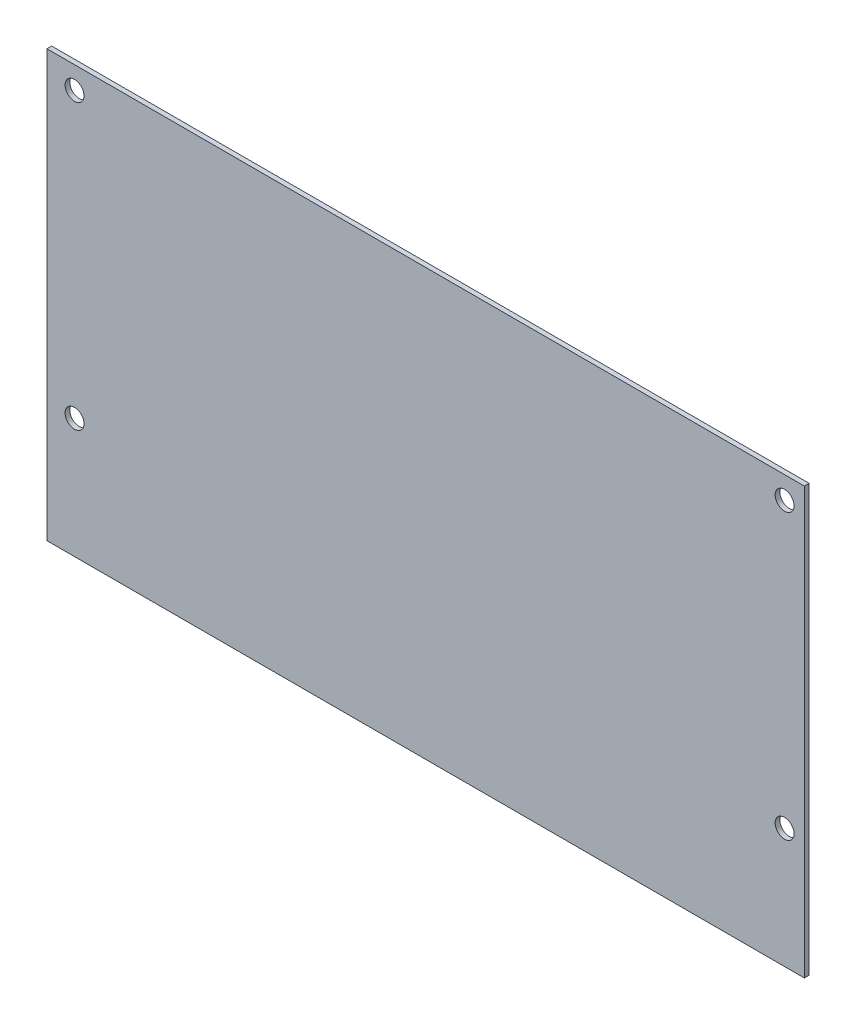
ISO-10303-21;
HEADER;
FILE_DESCRIPTION(('STEP AP214'),'2;1');
FILE_NAME('part.step','',(''),(''),'','','');
FILE_SCHEMA(('AUTOMOTIVE_DESIGN { 1 0 10303 214 1 1 1 1 }'));
ENDSEC;
DATA;
#1=APPLICATION_CONTEXT('core data for automotive mechanical design processes');
#2=APPLICATION_PROTOCOL_DEFINITION('international standard','automotive_design',2000,#1);
#3=PRODUCT_CONTEXT('',#1,'mechanical');
#4=PRODUCT('Part','Part','',(#3));
#5=PRODUCT_RELATED_PRODUCT_CATEGORY('part','',(#4));
#6=PRODUCT_DEFINITION_FORMATION('','',#4);
#7=PRODUCT_DEFINITION_CONTEXT('part definition',#1,'design');
#8=PRODUCT_DEFINITION('design','',#6,#7);
#9=PRODUCT_DEFINITION_SHAPE('','',#8);
#10=(LENGTH_UNIT() NAMED_UNIT(*) SI_UNIT(.MILLI.,.METRE.));
#11=(NAMED_UNIT(*) PLANE_ANGLE_UNIT() SI_UNIT($,.RADIAN.));
#12=(NAMED_UNIT(*) SI_UNIT($,.STERADIAN.) SOLID_ANGLE_UNIT());
#13=UNCERTAINTY_MEASURE_WITH_UNIT(LENGTH_MEASURE(1.E-05),#10,'distance_accuracy_value','');
#14=(GEOMETRIC_REPRESENTATION_CONTEXT(3) GLOBAL_UNCERTAINTY_ASSIGNED_CONTEXT((#13)) GLOBAL_UNIT_ASSIGNED_CONTEXT((#10,
#11,#12)) REPRESENTATION_CONTEXT('',''));
#15=CARTESIAN_POINT('',(0.,0.,0.));
#16=DIRECTION('',(0.,0.,1.));
#17=DIRECTION('',(1.,0.,0.));
#18=AXIS2_PLACEMENT_3D('',#15,#16,#17);
#19=CARTESIAN_POINT('',(0.,0.,1.));
#20=DIRECTION('',(1.,0.,0.));
#21=DIRECTION('',(0.,0.,-1.));
#22=AXIS2_PLACEMENT_3D('',#19,#20,#21);
#23=PLANE('',#22);
#24=DIRECTION('',(0.,-1.,0.));
#25=VECTOR('',#24,1.);
#26=CARTESIAN_POINT('',(0.,0.,0.));
#27=LINE('',#26,#25);
#28=CARTESIAN_POINT('',(0.,90.,0.));
#29=VERTEX_POINT('',#28);
#30=CARTESIAN_POINT('',(0.,0.,0.));
#31=VERTEX_POINT('',#30);
#32=EDGE_CURVE('E103',#29,#31,#27,.T.);
#33=ORIENTED_EDGE('',*,*,#32,.T.);
#34=DIRECTION('',(0.,0.,-1.));
#35=VECTOR('',#34,1.);
#36=CARTESIAN_POINT('',(0.,0.,1.));
#37=LINE('',#36,#35);
#38=CARTESIAN_POINT('',(0.,0.,1.));
#39=VERTEX_POINT('',#38);
#40=EDGE_CURVE('E11',#39,#31,#37,.T.);
#41=ORIENTED_EDGE('',*,*,#40,.F.);
#42=DIRECTION('',(0.,-1.,0.));
#43=VECTOR('',#42,1.);
#44=CARTESIAN_POINT('',(0.,0.,1.));
#45=LINE('',#44,#43);
#46=CARTESIAN_POINT('',(0.,90.,1.));
#47=VERTEX_POINT('',#46);
#48=EDGE_CURVE('E90',#47,#39,#45,.T.);
#49=ORIENTED_EDGE('',*,*,#48,.F.);
#50=DIRECTION('',(0.,0.,-1.));
#51=VECTOR('',#50,1.);
#52=CARTESIAN_POINT('',(0.,90.,1.));
#53=LINE('',#52,#51);
#54=EDGE_CURVE('E99',#47,#29,#53,.T.);
#55=ORIENTED_EDGE('',*,*,#54,.T.);
#56=EDGE_LOOP('',(#33,#41,#49,#55));
#57=FACE_BOUND('',#56,.T.);
#58=ADVANCED_FACE('F37',(#57),#23,.F.);
#59=CARTESIAN_POINT('',(0.,0.,1.));
#60=DIRECTION('',(0.,1.,0.));
#61=DIRECTION('',(0.,0.,1.));
#62=AXIS2_PLACEMENT_3D('',#59,#60,#61);
#63=PLANE('',#62);
#64=DIRECTION('',(1.,0.,0.));
#65=VECTOR('',#64,1.);
#66=CARTESIAN_POINT('',(0.,0.,0.));
#67=LINE('',#66,#65);
#68=CARTESIAN_POINT('',(160.,0.,0.));
#69=VERTEX_POINT('',#68);
#70=EDGE_CURVE('E94',#31,#69,#67,.T.);
#71=ORIENTED_EDGE('',*,*,#70,.T.);
#72=DIRECTION('',(0.,0.,-1.));
#73=VECTOR('',#72,1.);
#74=CARTESIAN_POINT('',(160.,0.,1.));
#75=LINE('',#74,#73);
#76=CARTESIAN_POINT('',(160.,0.,1.));
#77=VERTEX_POINT('',#76);
#78=EDGE_CURVE('E46',#77,#69,#75,.T.);
#79=ORIENTED_EDGE('',*,*,#78,.F.);
#80=DIRECTION('',(1.,0.,0.));
#81=VECTOR('',#80,1.);
#82=CARTESIAN_POINT('',(0.,0.,1.));
#83=LINE('',#82,#81);
#84=EDGE_CURVE('E85',#39,#77,#83,.T.);
#85=ORIENTED_EDGE('',*,*,#84,.F.);
#86=ORIENTED_EDGE('',*,*,#40,.T.);
#87=EDGE_LOOP('',(#71,#79,#85,#86));
#88=FACE_BOUND('',#87,.T.);
#89=ADVANCED_FACE('F93',(#88),#63,.F.);
#90=CARTESIAN_POINT('',(160.,0.,1.));
#91=DIRECTION('',(-1.,0.,0.));
#92=DIRECTION('',(0.,0.,1.));
#93=AXIS2_PLACEMENT_3D('',#90,#91,#92);
#94=PLANE('',#93);
#95=DIRECTION('',(0.,1.,0.));
#96=VECTOR('',#95,1.);
#97=CARTESIAN_POINT('',(160.,0.,0.));
#98=LINE('',#97,#96);
#99=CARTESIAN_POINT('',(160.,90.,0.));
#100=VERTEX_POINT('',#99);
#101=EDGE_CURVE('E72',#69,#100,#98,.T.);
#102=ORIENTED_EDGE('',*,*,#101,.T.);
#103=DIRECTION('',(0.,0.,-1.));
#104=VECTOR('',#103,1.);
#105=CARTESIAN_POINT('',(160.,90.,1.));
#106=LINE('',#105,#104);
#107=CARTESIAN_POINT('',(160.,90.,1.));
#108=VERTEX_POINT('',#107);
#109=EDGE_CURVE('E95',#108,#100,#106,.T.);
#110=ORIENTED_EDGE('',*,*,#109,.F.);
#111=DIRECTION('',(0.,1.,0.));
#112=VECTOR('',#111,1.);
#113=CARTESIAN_POINT('',(160.,0.,1.));
#114=LINE('',#113,#112);
#115=EDGE_CURVE('E88',#77,#108,#114,.T.);
#116=ORIENTED_EDGE('',*,*,#115,.F.);
#117=ORIENTED_EDGE('',*,*,#78,.T.);
#118=EDGE_LOOP('',(#102,#110,#116,#117));
#119=FACE_BOUND('',#118,.T.);
#120=ADVANCED_FACE('F97',(#119),#94,.F.);
#121=CARTESIAN_POINT('',(0.,90.,1.));
#122=DIRECTION('',(0.,-1.,0.));
#123=DIRECTION('',(0.,0.,-1.));
#124=AXIS2_PLACEMENT_3D('',#121,#122,#123);
#125=PLANE('',#124);
#126=DIRECTION('',(-1.,0.,0.));
#127=VECTOR('',#126,1.);
#128=CARTESIAN_POINT('',(0.,90.,0.));
#129=LINE('',#128,#127);
#130=EDGE_CURVE('E78',#100,#29,#129,.T.);
#131=ORIENTED_EDGE('',*,*,#130,.T.);
#132=ORIENTED_EDGE('',*,*,#54,.F.);
#133=DIRECTION('',(-1.,0.,0.));
#134=VECTOR('',#133,1.);
#135=CARTESIAN_POINT('',(0.,90.,1.));
#136=LINE('',#135,#134);
#137=EDGE_CURVE('E55',#108,#47,#136,.T.);
#138=ORIENTED_EDGE('',*,*,#137,.F.);
#139=ORIENTED_EDGE('',*,*,#109,.T.);
#140=EDGE_LOOP('',(#131,#132,#138,#139));
#141=FACE_BOUND('',#140,.T.);
#142=ADVANCED_FACE('F139',(#141),#125,.F.);
#143=CARTESIAN_POINT('',(0.,0.,1.));
#144=DIRECTION('',(0.,0.,-1.));
#145=DIRECTION('',(-1.,0.,0.));
#146=AXIS2_PLACEMENT_3D('',#143,#144,#145);
#147=PLANE('',#146);
#148=CARTESIAN_POINT('',(5.83216523004638,25.3004824183685,1.));
#149=DIRECTION('',(0.,0.,1.));
#150=DIRECTION('',(1.,0.,0.));
#151=AXIS2_PLACEMENT_3D('',#148,#149,#150);
#152=CIRCLE('',#151,1.99999999999999);
#153=CARTESIAN_POINT('',(7.83216523004637,25.3004824183685,1.));
#154=VERTEX_POINT('',#153);
#155=EDGE_CURVE('E221',#154,#154,#152,.T.);
#156=ORIENTED_EDGE('',*,*,#155,.F.);
#157=EDGE_LOOP('',(#156));
#158=FACE_BOUND('',#157,.T.);
#159=CARTESIAN_POINT('',(155.832165230046,25.3004824183685,1.));
#160=DIRECTION('',(0.,0.,1.));
#161=DIRECTION('',(1.,0.,0.));
#162=AXIS2_PLACEMENT_3D('',#159,#160,#161);
#163=CIRCLE('',#162,2.);
#164=CARTESIAN_POINT('',(157.832165230046,25.3004824183685,1.));
#165=VERTEX_POINT('',#164);
#166=EDGE_CURVE('E218',#165,#165,#163,.T.);
#167=ORIENTED_EDGE('',*,*,#166,.F.);
#168=EDGE_LOOP('',(#167));
#169=FACE_BOUND('',#168,.T.);
#170=CARTESIAN_POINT('',(155.832165230046,85.3004824183685,1.));
#171=DIRECTION('',(0.,0.,1.));
#172=DIRECTION('',(1.,0.,0.));
#173=AXIS2_PLACEMENT_3D('',#170,#171,#172);
#174=CIRCLE('',#173,2.);
#175=CARTESIAN_POINT('',(157.832165230046,85.3004824183685,1.));
#176=VERTEX_POINT('',#175);
#177=EDGE_CURVE('E220',#176,#176,#174,.T.);
#178=ORIENTED_EDGE('',*,*,#177,.F.);
#179=EDGE_LOOP('',(#178));
#180=FACE_BOUND('',#179,.T.);
#181=CARTESIAN_POINT('',(5.83216523004637,85.3004824183685,1.));
#182=DIRECTION('',(0.,0.,1.));
#183=DIRECTION('',(1.,0.,0.));
#184=AXIS2_PLACEMENT_3D('',#181,#182,#183);
#185=CIRCLE('',#184,2.00000000000001);
#186=CARTESIAN_POINT('',(7.83216523004638,85.3004824183685,1.));
#187=VERTEX_POINT('',#186);
#188=EDGE_CURVE('E115',#187,#187,#185,.T.);
#189=ORIENTED_EDGE('',*,*,#188,.F.);
#190=EDGE_LOOP('',(#189));
#191=FACE_BOUND('',#190,.T.);
#192=ORIENTED_EDGE('',*,*,#48,.T.);
#193=ORIENTED_EDGE('',*,*,#84,.T.);
#194=ORIENTED_EDGE('',*,*,#115,.T.);
#195=ORIENTED_EDGE('',*,*,#137,.T.);
#196=EDGE_LOOP('',(#192,#193,#194,#195));
#197=FACE_BOUND('',#196,.T.);
#198=ADVANCED_FACE('F86',(#158,#169,#180,#191,#197),#147,.F.);
#199=CARTESIAN_POINT('',(0.,0.,0.));
#200=DIRECTION('',(0.,0.,-1.));
#201=DIRECTION('',(-1.,0.,0.));
#202=AXIS2_PLACEMENT_3D('',#199,#200,#201);
#203=PLANE('',#202);
#204=CARTESIAN_POINT('',(5.83216523004638,25.3004824183685,0.));
#205=DIRECTION('',(0.,0.,-1.));
#206=DIRECTION('',(-1.,0.,0.));
#207=AXIS2_PLACEMENT_3D('',#204,#205,#206);
#208=CIRCLE('',#207,1.99999999999999);
#209=CARTESIAN_POINT('',(3.83216523004638,25.3004824183685,0.));
#210=VERTEX_POINT('',#209);
#211=EDGE_CURVE('E40',#210,#210,#208,.T.);
#212=ORIENTED_EDGE('',*,*,#211,.F.);
#213=EDGE_LOOP('',(#212));
#214=FACE_BOUND('',#213,.T.);
#215=CARTESIAN_POINT('',(155.832165230046,25.3004824183685,0.));
#216=DIRECTION('',(0.,0.,-1.));
#217=DIRECTION('',(-1.,0.,0.));
#218=AXIS2_PLACEMENT_3D('',#215,#216,#217);
#219=CIRCLE('',#218,2.);
#220=CARTESIAN_POINT('',(153.832165230046,25.3004824183685,0.));
#221=VERTEX_POINT('',#220);
#222=EDGE_CURVE('E117',#221,#221,#219,.T.);
#223=ORIENTED_EDGE('',*,*,#222,.F.);
#224=EDGE_LOOP('',(#223));
#225=FACE_BOUND('',#224,.T.);
#226=CARTESIAN_POINT('',(155.832165230046,85.3004824183685,0.));
#227=DIRECTION('',(0.,0.,-1.));
#228=DIRECTION('',(-1.,0.,0.));
#229=AXIS2_PLACEMENT_3D('',#226,#227,#228);
#230=CIRCLE('',#229,2.);
#231=CARTESIAN_POINT('',(153.832165230046,85.3004824183685,0.));
#232=VERTEX_POINT('',#231);
#233=EDGE_CURVE('E114',#232,#232,#230,.T.);
#234=ORIENTED_EDGE('',*,*,#233,.F.);
#235=EDGE_LOOP('',(#234));
#236=FACE_BOUND('',#235,.T.);
#237=CARTESIAN_POINT('',(5.83216523004637,85.3004824183685,0.));
#238=DIRECTION('',(0.,0.,-1.));
#239=DIRECTION('',(-1.,0.,0.));
#240=AXIS2_PLACEMENT_3D('',#237,#238,#239);
#241=CIRCLE('',#240,2.00000000000001);
#242=CARTESIAN_POINT('',(3.83216523004636,85.3004824183685,0.));
#243=VERTEX_POINT('',#242);
#244=EDGE_CURVE('E111',#243,#243,#241,.T.);
#245=ORIENTED_EDGE('',*,*,#244,.F.);
#246=EDGE_LOOP('',(#245));
#247=FACE_BOUND('',#246,.T.);
#248=ORIENTED_EDGE('',*,*,#32,.F.);
#249=ORIENTED_EDGE('',*,*,#130,.F.);
#250=ORIENTED_EDGE('',*,*,#101,.F.);
#251=ORIENTED_EDGE('',*,*,#70,.F.);
#252=EDGE_LOOP('',(#248,#249,#250,#251));
#253=FACE_BOUND('',#252,.T.);
#254=ADVANCED_FACE('F127',(#214,#225,#236,#247,#253),#203,.T.);
#255=CARTESIAN_POINT('',(5.83216523004637,85.3004824183685,-9.));
#256=DIRECTION('',(0.,0.,1.));
#257=DIRECTION('',(1.,0.,0.));
#258=AXIS2_PLACEMENT_3D('',#255,#256,#257);
#259=CYLINDRICAL_SURFACE('',#258,2.00000000000001);
#260=ORIENTED_EDGE('',*,*,#244,.T.);
#261=EDGE_LOOP('',(#260));
#262=FACE_BOUND('',#261,.T.);
#263=ORIENTED_EDGE('',*,*,#188,.T.);
#264=EDGE_LOOP('',(#263));
#265=FACE_BOUND('',#264,.T.);
#266=ADVANCED_FACE('F130',(#262,#265),#259,.F.);
#267=CARTESIAN_POINT('',(155.832165230046,85.3004824183685,-9.));
#268=DIRECTION('',(0.,0.,1.));
#269=DIRECTION('',(1.,0.,0.));
#270=AXIS2_PLACEMENT_3D('',#267,#268,#269);
#271=CYLINDRICAL_SURFACE('',#270,2.);
#272=ORIENTED_EDGE('',*,*,#233,.T.);
#273=EDGE_LOOP('',(#272));
#274=FACE_BOUND('',#273,.T.);
#275=ORIENTED_EDGE('',*,*,#177,.T.);
#276=EDGE_LOOP('',(#275));
#277=FACE_BOUND('',#276,.T.);
#278=ADVANCED_FACE('F184',(#274,#277),#271,.F.);
#279=CARTESIAN_POINT('',(155.832165230046,25.3004824183685,-9.));
#280=DIRECTION('',(0.,0.,1.));
#281=DIRECTION('',(1.,0.,0.));
#282=AXIS2_PLACEMENT_3D('',#279,#280,#281);
#283=CYLINDRICAL_SURFACE('',#282,2.);
#284=ORIENTED_EDGE('',*,*,#222,.T.);
#285=EDGE_LOOP('',(#284));
#286=FACE_BOUND('',#285,.T.);
#287=ORIENTED_EDGE('',*,*,#166,.T.);
#288=EDGE_LOOP('',(#287));
#289=FACE_BOUND('',#288,.T.);
#290=ADVANCED_FACE('F194',(#286,#289),#283,.F.);
#291=CARTESIAN_POINT('',(5.83216523004638,25.3004824183685,-9.));
#292=DIRECTION('',(0.,0.,1.));
#293=DIRECTION('',(1.,0.,0.));
#294=AXIS2_PLACEMENT_3D('',#291,#292,#293);
#295=CYLINDRICAL_SURFACE('',#294,1.99999999999999);
#296=ORIENTED_EDGE('',*,*,#211,.T.);
#297=EDGE_LOOP('',(#296));
#298=FACE_BOUND('',#297,.T.);
#299=ORIENTED_EDGE('',*,*,#155,.T.);
#300=EDGE_LOOP('',(#299));
#301=FACE_BOUND('',#300,.T.);
#302=ADVANCED_FACE('F124',(#298,#301),#295,.F.);
#303=CLOSED_SHELL('',(#58,#89,#120,#142,#198,#254,#266,#278,#290,#302));
#304=MANIFOLD_SOLID_BREP('B2',#303);
#305=ADVANCED_BREP_SHAPE_REPRESENTATION('',(#18,#304),#14);
#306=SHAPE_DEFINITION_REPRESENTATION(#9,#305);
ENDSEC;
END-ISO-10303-21;
